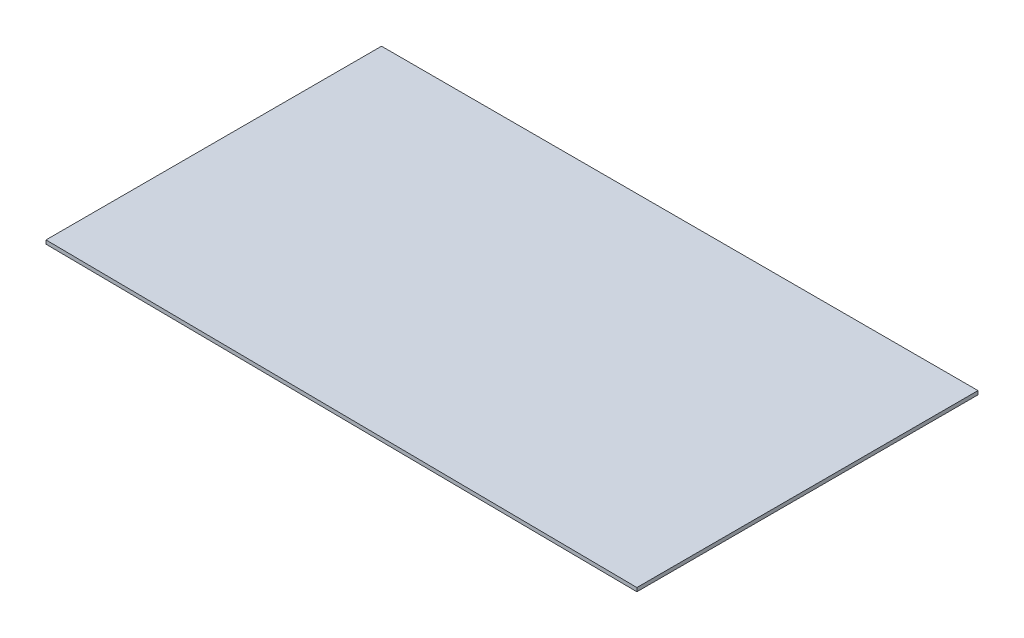
ISO-10303-21;
HEADER;
FILE_DESCRIPTION(('STEP AP214'),'2;1');
FILE_NAME('part.step','',(''),(''),'','','');
FILE_SCHEMA(('AUTOMOTIVE_DESIGN { 1 0 10303 214 1 1 1 1 }'));
ENDSEC;
DATA;
#1=APPLICATION_CONTEXT('core data for automotive mechanical design processes');
#2=APPLICATION_PROTOCOL_DEFINITION('international standard','automotive_design',2000,#1);
#3=PRODUCT_CONTEXT('',#1,'mechanical');
#4=PRODUCT('Part','Part','',(#3));
#5=PRODUCT_RELATED_PRODUCT_CATEGORY('part','',(#4));
#6=PRODUCT_DEFINITION_FORMATION('','',#4);
#7=PRODUCT_DEFINITION_CONTEXT('part definition',#1,'design');
#8=PRODUCT_DEFINITION('design','',#6,#7);
#9=PRODUCT_DEFINITION_SHAPE('','',#8);
#10=(LENGTH_UNIT() NAMED_UNIT(*) SI_UNIT(.MILLI.,.METRE.));
#11=(NAMED_UNIT(*) PLANE_ANGLE_UNIT() SI_UNIT($,.RADIAN.));
#12=(NAMED_UNIT(*) SI_UNIT($,.STERADIAN.) SOLID_ANGLE_UNIT());
#13=UNCERTAINTY_MEASURE_WITH_UNIT(LENGTH_MEASURE(1.E-05),#10,'distance_accuracy_value','');
#14=(GEOMETRIC_REPRESENTATION_CONTEXT(3) GLOBAL_UNCERTAINTY_ASSIGNED_CONTEXT((#13)) GLOBAL_UNIT_ASSIGNED_CONTEXT((#10,
#11,#12)) REPRESENTATION_CONTEXT('',''));
#15=CARTESIAN_POINT('',(0.,0.,0.));
#16=DIRECTION('',(0.,0.,1.));
#17=DIRECTION('',(1.,0.,0.));
#18=AXIS2_PLACEMENT_3D('',#15,#16,#17);
#19=CARTESIAN_POINT('',(0.,0.,0.));
#20=DIRECTION('',(0.,-1.,0.));
#21=DIRECTION('',(0.,0.,-1.));
#22=AXIS2_PLACEMENT_3D('',#19,#20,#21);
#23=PLANE('',#22);
#24=DIRECTION('',(0.,0.,-1.));
#25=VECTOR('',#24,1.);
#26=CARTESIAN_POINT('',(-69.65,0.,37.9795133830879));
#27=LINE('',#26,#25);
#28=CARTESIAN_POINT('',(-69.65,0.,37.9795133830879));
#29=VERTEX_POINT('',#28);
#30=CARTESIAN_POINT('',(-69.65,0.,32.0204866169121));
#31=VERTEX_POINT('',#30);
#32=EDGE_CURVE('E383',#29,#31,#27,.T.);
#33=ORIENTED_EDGE('',*,*,#32,.F.);
#34=CARTESIAN_POINT('',(-70.,0.,35.));
#35=DIRECTION('',(0.,-1.,0.));
#36=DIRECTION('',(0.,0.,-1.));
#37=AXIS2_PLACEMENT_3D('',#34,#35,#36);
#38=CIRCLE('',#37,3.00000000000001);
#39=EDGE_CURVE('E534',#31,#29,#38,.T.);
#40=ORIENTED_EDGE('',*,*,#39,.F.);
#41=EDGE_LOOP('',(#33,#40));
#42=FACE_BOUND('',#41,.T.);
#43=DIRECTION('',(0.,0.,-1.));
#44=VECTOR('',#43,1.);
#45=CARTESIAN_POINT('',(70.35,0.,37.9795133830879));
#46=LINE('',#45,#44);
#47=CARTESIAN_POINT('',(70.35,0.,37.9795133830879));
#48=VERTEX_POINT('',#47);
#49=CARTESIAN_POINT('',(70.35,0.,32.0204866169121));
#50=VERTEX_POINT('',#49);
#51=EDGE_CURVE('E327',#48,#50,#46,.T.);
#52=ORIENTED_EDGE('',*,*,#51,.F.);
#53=CARTESIAN_POINT('',(70.,0.,35.));
#54=DIRECTION('',(0.,-1.,0.));
#55=DIRECTION('',(0.,0.,-1.));
#56=AXIS2_PLACEMENT_3D('',#53,#54,#55);
#57=CIRCLE('',#56,3.00000000000001);
#58=EDGE_CURVE('E70',#50,#48,#57,.T.);
#59=ORIENTED_EDGE('',*,*,#58,.F.);
#60=EDGE_LOOP('',(#52,#59));
#61=FACE_BOUND('',#60,.T.);
#62=DIRECTION('',(0.,0.,-1.));
#63=VECTOR('',#62,1.);
#64=CARTESIAN_POINT('',(70.35,0.,-32.0204866169121));
#65=LINE('',#64,#63);
#66=CARTESIAN_POINT('',(70.35,0.,-32.0204866169121));
#67=VERTEX_POINT('',#66);
#68=CARTESIAN_POINT('',(70.35,0.,-37.9795133830879));
#69=VERTEX_POINT('',#68);
#70=EDGE_CURVE('E262',#67,#69,#65,.T.);
#71=ORIENTED_EDGE('',*,*,#70,.F.);
#72=CARTESIAN_POINT('',(70.,0.,-35.));
#73=DIRECTION('',(0.,-1.,0.));
#74=DIRECTION('',(0.,0.,-1.));
#75=AXIS2_PLACEMENT_3D('',#72,#73,#74);
#76=CIRCLE('',#75,3.00000000000001);
#77=EDGE_CURVE('E646',#69,#67,#76,.T.);
#78=ORIENTED_EDGE('',*,*,#77,.F.);
#79=EDGE_LOOP('',(#71,#78));
#80=FACE_BOUND('',#79,.T.);
#81=DIRECTION('',(0.,0.,-1.));
#82=VECTOR('',#81,1.);
#83=CARTESIAN_POINT('',(-69.65,0.,-32.0204866169121));
#84=LINE('',#83,#82);
#85=CARTESIAN_POINT('',(-69.65,0.,-32.0204866169121));
#86=VERTEX_POINT('',#85);
#87=CARTESIAN_POINT('',(-69.65,0.,-37.9795133830879));
#88=VERTEX_POINT('',#87);
#89=EDGE_CURVE('E605',#86,#88,#84,.T.);
#90=ORIENTED_EDGE('',*,*,#89,.F.);
#91=CARTESIAN_POINT('',(-70.,0.,-35.));
#92=DIRECTION('',(0.,-1.,0.));
#93=DIRECTION('',(0.,0.,-1.));
#94=AXIS2_PLACEMENT_3D('',#91,#92,#93);
#95=CIRCLE('',#94,3.00000000000001);
#96=EDGE_CURVE('E634',#88,#86,#95,.T.);
#97=ORIENTED_EDGE('',*,*,#96,.F.);
#98=EDGE_LOOP('',(#90,#97));
#99=FACE_BOUND('',#98,.T.);
#100=DIRECTION('',(0.,0.,1.));
#101=VECTOR('',#100,1.);
#102=CARTESIAN_POINT('',(-80.,0.,45.));
#103=LINE('',#102,#101);
#104=CARTESIAN_POINT('',(-80.,0.,-45.));
#105=VERTEX_POINT('',#104);
#106=CARTESIAN_POINT('',(-80.,0.,45.));
#107=VERTEX_POINT('',#106);
#108=EDGE_CURVE('E473',#105,#107,#103,.T.);
#109=ORIENTED_EDGE('',*,*,#108,.F.);
#110=DIRECTION('',(-1.,0.,0.));
#111=VECTOR('',#110,1.);
#112=CARTESIAN_POINT('',(-80.,0.,-45.));
#113=LINE('',#112,#111);
#114=CARTESIAN_POINT('',(80.,0.,-45.));
#115=VERTEX_POINT('',#114);
#116=EDGE_CURVE('E482',#115,#105,#113,.T.);
#117=ORIENTED_EDGE('',*,*,#116,.F.);
#118=DIRECTION('',(0.,0.,-1.));
#119=VECTOR('',#118,1.);
#120=CARTESIAN_POINT('',(80.,0.,-45.));
#121=LINE('',#120,#119);
#122=CARTESIAN_POINT('',(80.,0.,46.5056368429094));
#123=VERTEX_POINT('',#122);
#124=EDGE_CURVE('E472',#123,#115,#121,.T.);
#125=ORIENTED_EDGE('',*,*,#124,.F.);
#126=DIRECTION('',(0.999955726723508,0.,0.0094098136464571));
#127=VECTOR('',#126,1.);
#128=CARTESIAN_POINT('',(80.,0.,46.5056368429094));
#129=LINE('',#128,#127);
#130=EDGE_CURVE('E463',#107,#123,#129,.T.);
#131=ORIENTED_EDGE('',*,*,#130,.F.);
#132=EDGE_LOOP('',(#109,#117,#125,#131));
#133=FACE_BOUND('',#132,.T.);
#134=CARTESIAN_POINT('',(69.65,0.,-32.0204866169121));
#135=VERTEX_POINT('',#134);
#136=CARTESIAN_POINT('',(69.65,0.,-37.9795133830879));
#137=VERTEX_POINT('',#136);
#138=EDGE_CURVE('E62',#135,#137,#76,.T.);
#139=ORIENTED_EDGE('',*,*,#138,.F.);
#140=DIRECTION('',(0.,0.,1.));
#141=VECTOR('',#140,1.);
#142=CARTESIAN_POINT('',(69.65,0.,-32.0204866169121));
#143=LINE('',#142,#141);
#144=EDGE_CURVE('E369',#137,#135,#143,.T.);
#145=ORIENTED_EDGE('',*,*,#144,.F.);
#146=EDGE_LOOP('',(#139,#145));
#147=FACE_BOUND('',#146,.T.);
#148=CARTESIAN_POINT('',(-70.35,0.,-32.0204866169121));
#149=VERTEX_POINT('',#148);
#150=CARTESIAN_POINT('',(-70.35,0.,-37.9795133830879));
#151=VERTEX_POINT('',#150);
#152=EDGE_CURVE('E638',#149,#151,#95,.T.);
#153=ORIENTED_EDGE('',*,*,#152,.F.);
#154=DIRECTION('',(0.,0.,1.));
#155=VECTOR('',#154,1.);
#156=CARTESIAN_POINT('',(-70.35,0.,-32.0204866169121));
#157=LINE('',#156,#155);
#158=EDGE_CURVE('E276',#151,#149,#157,.T.);
#159=ORIENTED_EDGE('',*,*,#158,.F.);
#160=EDGE_LOOP('',(#153,#159));
#161=FACE_BOUND('',#160,.T.);
#162=CARTESIAN_POINT('',(-70.35,0.,37.9795133830879));
#163=VERTEX_POINT('',#162);
#164=CARTESIAN_POINT('',(-70.35,0.,32.0204866169121));
#165=VERTEX_POINT('',#164);
#166=EDGE_CURVE('E531',#163,#165,#38,.T.);
#167=ORIENTED_EDGE('',*,*,#166,.F.);
#168=DIRECTION('',(0.,0.,1.));
#169=VECTOR('',#168,1.);
#170=CARTESIAN_POINT('',(-70.35,0.,37.9795133830879));
#171=LINE('',#170,#169);
#172=EDGE_CURVE('E387',#165,#163,#171,.T.);
#173=ORIENTED_EDGE('',*,*,#172,.F.);
#174=EDGE_LOOP('',(#167,#173));
#175=FACE_BOUND('',#174,.T.);
#176=CARTESIAN_POINT('',(69.65,0.,37.9795133830879));
#177=VERTEX_POINT('',#176);
#178=CARTESIAN_POINT('',(69.65,0.,32.0204866169121));
#179=VERTEX_POINT('',#178);
#180=EDGE_CURVE('E252',#177,#179,#57,.T.);
#181=ORIENTED_EDGE('',*,*,#180,.F.);
#182=DIRECTION('',(0.,0.,1.));
#183=VECTOR('',#182,1.);
#184=CARTESIAN_POINT('',(69.65,0.,37.9795133830879));
#185=LINE('',#184,#183);
#186=EDGE_CURVE('E423',#179,#177,#185,.T.);
#187=ORIENTED_EDGE('',*,*,#186,.F.);
#188=EDGE_LOOP('',(#181,#187));
#189=FACE_BOUND('',#188,.T.);
#190=ADVANCED_FACE('F46',(#42,#61,#80,#99,#133,#147,#161,#175,#189),#23,.T.);
#191=CARTESIAN_POINT('',(-80.,1.,45.));
#192=DIRECTION('',(1.,0.,0.));
#193=DIRECTION('',(0.,0.,-1.));
#194=AXIS2_PLACEMENT_3D('',#191,#192,#193);
#195=PLANE('',#194);
#196=ORIENTED_EDGE('',*,*,#108,.T.);
#197=DIRECTION('',(0.,-1.,0.));
#198=VECTOR('',#197,1.);
#199=CARTESIAN_POINT('',(-80.,1.,45.));
#200=LINE('',#199,#198);
#201=CARTESIAN_POINT('',(-80.,1.,45.));
#202=VERTEX_POINT('',#201);
#203=EDGE_CURVE('E12',#202,#107,#200,.T.);
#204=ORIENTED_EDGE('',*,*,#203,.F.);
#205=DIRECTION('',(0.,0.,1.));
#206=VECTOR('',#205,1.);
#207=CARTESIAN_POINT('',(-80.,1.,45.));
#208=LINE('',#207,#206);
#209=CARTESIAN_POINT('',(-80.,1.,-45.));
#210=VERTEX_POINT('',#209);
#211=EDGE_CURVE('E486',#210,#202,#208,.T.);
#212=ORIENTED_EDGE('',*,*,#211,.F.);
#213=DIRECTION('',(0.,-1.,0.));
#214=VECTOR('',#213,1.);
#215=CARTESIAN_POINT('',(-80.,1.,-45.));
#216=LINE('',#215,#214);
#217=EDGE_CURVE('E490',#210,#105,#216,.T.);
#218=ORIENTED_EDGE('',*,*,#217,.T.);
#219=EDGE_LOOP('',(#196,#204,#212,#218));
#220=FACE_BOUND('',#219,.T.);
#221=ADVANCED_FACE('F48',(#220),#195,.F.);
#222=CARTESIAN_POINT('',(80.,1.,46.5056368429094));
#223=DIRECTION('',(0.0094098136464571,0.,-0.999955726723508));
#224=DIRECTION('',(-0.999955726723508,0.,-0.0094098136464571));
#225=AXIS2_PLACEMENT_3D('',#222,#223,#224);
#226=PLANE('',#225);
#227=ORIENTED_EDGE('',*,*,#130,.T.);
#228=DIRECTION('',(0.,-1.,0.));
#229=VECTOR('',#228,1.);
#230=CARTESIAN_POINT('',(80.,1.,46.5056368429094));
#231=LINE('',#230,#229);
#232=CARTESIAN_POINT('',(80.,1.,46.5056368429094));
#233=VERTEX_POINT('',#232);
#234=EDGE_CURVE('E55',#233,#123,#231,.T.);
#235=ORIENTED_EDGE('',*,*,#234,.F.);
#236=DIRECTION('',(0.999955726723508,0.,0.0094098136464571));
#237=VECTOR('',#236,1.);
#238=CARTESIAN_POINT('',(80.,1.,46.5056368429094));
#239=LINE('',#238,#237);
#240=EDGE_CURVE('E503',#202,#233,#239,.T.);
#241=ORIENTED_EDGE('',*,*,#240,.F.);
#242=ORIENTED_EDGE('',*,*,#203,.T.);
#243=EDGE_LOOP('',(#227,#235,#241,#242));
#244=FACE_BOUND('',#243,.T.);
#245=ADVANCED_FACE('F454',(#244),#226,.F.);
#246=CARTESIAN_POINT('',(80.,1.,-45.));
#247=DIRECTION('',(-1.,0.,0.));
#248=DIRECTION('',(0.,0.,1.));
#249=AXIS2_PLACEMENT_3D('',#246,#247,#248);
#250=PLANE('',#249);
#251=ORIENTED_EDGE('',*,*,#124,.T.);
#252=DIRECTION('',(0.,-1.,0.));
#253=VECTOR('',#252,1.);
#254=CARTESIAN_POINT('',(80.,1.,-45.));
#255=LINE('',#254,#253);
#256=CARTESIAN_POINT('',(80.,1.,-45.));
#257=VERTEX_POINT('',#256);
#258=EDGE_CURVE('E479',#257,#115,#255,.T.);
#259=ORIENTED_EDGE('',*,*,#258,.F.);
#260=DIRECTION('',(0.,0.,-1.));
#261=VECTOR('',#260,1.);
#262=CARTESIAN_POINT('',(80.,1.,-45.));
#263=LINE('',#262,#261);
#264=EDGE_CURVE('E477',#233,#257,#263,.T.);
#265=ORIENTED_EDGE('',*,*,#264,.F.);
#266=ORIENTED_EDGE('',*,*,#234,.T.);
#267=EDGE_LOOP('',(#251,#259,#265,#266));
#268=FACE_BOUND('',#267,.T.);
#269=ADVANCED_FACE('F451',(#268),#250,.F.);
#270=CARTESIAN_POINT('',(-80.,1.,-45.));
#271=DIRECTION('',(0.,0.,1.));
#272=DIRECTION('',(1.,0.,0.));
#273=AXIS2_PLACEMENT_3D('',#270,#271,#272);
#274=PLANE('',#273);
#275=ORIENTED_EDGE('',*,*,#116,.T.);
#276=ORIENTED_EDGE('',*,*,#217,.F.);
#277=DIRECTION('',(-1.,0.,0.));
#278=VECTOR('',#277,1.);
#279=CARTESIAN_POINT('',(-80.,1.,-45.));
#280=LINE('',#279,#278);
#281=EDGE_CURVE('E494',#257,#210,#280,.T.);
#282=ORIENTED_EDGE('',*,*,#281,.F.);
#283=ORIENTED_EDGE('',*,*,#258,.T.);
#284=EDGE_LOOP('',(#275,#276,#282,#283));
#285=FACE_BOUND('',#284,.T.);
#286=ADVANCED_FACE('F444',(#285),#274,.F.);
#287=CARTESIAN_POINT('',(0.,1.,0.));
#288=DIRECTION('',(0.,-1.,0.));
#289=DIRECTION('',(0.,0.,-1.));
#290=AXIS2_PLACEMENT_3D('',#287,#288,#289);
#291=PLANE('',#290);
#292=ORIENTED_EDGE('',*,*,#211,.T.);
#293=ORIENTED_EDGE('',*,*,#240,.T.);
#294=ORIENTED_EDGE('',*,*,#264,.T.);
#295=ORIENTED_EDGE('',*,*,#281,.T.);
#296=EDGE_LOOP('',(#292,#293,#294,#295));
#297=FACE_BOUND('',#296,.T.);
#298=ADVANCED_FACE('F439',(#297),#291,.F.);
#299=CARTESIAN_POINT('',(-70.35,-2.7,35.));
#300=DIRECTION('',(0.,-1.,0.));
#301=DIRECTION('',(-1.,0.,0.));
#302=AXIS2_PLACEMENT_3D('',#299,#300,#301);
#303=ELLIPSE('',#302,3.,2.97951338308793);
#304=DIRECTION('',(0.,1.,0.));
#305=VECTOR('',#304,1.);
#306=SURFACE_OF_LINEAR_EXTRUSION('',#303,#305);
#307=DIRECTION('',(0.,1.,0.));
#308=VECTOR('',#307,1.);
#309=CARTESIAN_POINT('',(-70.35,-2.7,37.9795133830879));
#310=LINE('',#309,#308);
#311=CARTESIAN_POINT('',(-70.35,-2.7,37.9795133830879));
#312=VERTEX_POINT('',#311);
#313=CARTESIAN_POINT('',(-70.35,-2.,37.9795133830879));
#314=VERTEX_POINT('',#313);
#315=EDGE_CURVE('E510',#312,#314,#310,.T.);
#316=ORIENTED_EDGE('',*,*,#315,.T.);
#317=CARTESIAN_POINT('',(-70.35,-2.,35.));
#318=DIRECTION('',(0.,-1.,0.));
#319=DIRECTION('',(-1.,0.,0.));
#320=AXIS2_PLACEMENT_3D('',#317,#318,#319);
#321=ELLIPSE('',#320,3.,2.97951338308793);
#322=CARTESIAN_POINT('',(-70.35,-2.,32.0204866169121));
#323=VERTEX_POINT('',#322);
#324=EDGE_CURVE('E241',#314,#323,#321,.T.);
#325=ORIENTED_EDGE('',*,*,#324,.T.);
#326=DIRECTION('',(0.,1.,0.));
#327=VECTOR('',#326,1.);
#328=CARTESIAN_POINT('',(-70.35,-2.7,32.0204866169121));
#329=LINE('',#328,#327);
#330=CARTESIAN_POINT('',(-70.35,-2.7,32.0204866169121));
#331=VERTEX_POINT('',#330);
#332=EDGE_CURVE('E507',#331,#323,#329,.T.);
#333=ORIENTED_EDGE('',*,*,#332,.F.);
#334=EDGE_CURVE('E426',#312,#331,#303,.T.);
#335=ORIENTED_EDGE('',*,*,#334,.F.);
#336=EDGE_LOOP('',(#316,#325,#333,#335));
#337=FACE_BOUND('',#336,.T.);
#338=ADVANCED_FACE('F434',(#337),#306,.F.);
#339=CARTESIAN_POINT('',(-70.35,-2.7,37.9795133830879));
#340=DIRECTION('',(-1.,0.,0.));
#341=DIRECTION('',(0.,0.,1.));
#342=AXIS2_PLACEMENT_3D('',#339,#340,#341);
#343=PLANE('',#342);
#344=ORIENTED_EDGE('',*,*,#172,.T.);
#345=DIRECTION('',(0.,1.,0.));
#346=VECTOR('',#345,1.);
#347=CARTESIAN_POINT('',(-70.35,-2.,37.9795133830879));
#348=LINE('',#347,#346);
#349=EDGE_CURVE('E526',#163,#314,#348,.F.);
#350=ORIENTED_EDGE('',*,*,#349,.T.);
#351=ORIENTED_EDGE('',*,*,#315,.F.);
#352=DIRECTION('',(0.,0.,1.));
#353=VECTOR('',#352,1.);
#354=CARTESIAN_POINT('',(-70.35,-2.7,37.9795133830879));
#355=LINE('',#354,#353);
#356=EDGE_CURVE('E431',#331,#312,#355,.T.);
#357=ORIENTED_EDGE('',*,*,#356,.F.);
#358=ORIENTED_EDGE('',*,*,#332,.T.);
#359=DIRECTION('',(0.,1.,0.));
#360=VECTOR('',#359,1.);
#361=CARTESIAN_POINT('',(-70.35,-2.,32.0204866169121));
#362=LINE('',#361,#360);
#363=EDGE_CURVE('E527',#323,#165,#362,.T.);
#364=ORIENTED_EDGE('',*,*,#363,.T.);
#365=EDGE_LOOP('',(#344,#350,#351,#357,#358,#364));
#366=FACE_BOUND('',#365,.T.);
#367=ADVANCED_FACE('F438',(#366),#343,.F.);
#368=CARTESIAN_POINT('',(-70.35,-2.7,35.));
#369=DIRECTION('',(0.,-1.,0.));
#370=DIRECTION('',(0.,0.,-1.));
#371=AXIS2_PLACEMENT_3D('',#368,#369,#370);
#372=PLANE('',#371);
#373=ORIENTED_EDGE('',*,*,#334,.T.);
#374=ORIENTED_EDGE('',*,*,#356,.T.);
#375=EDGE_LOOP('',(#373,#374));
#376=FACE_BOUND('',#375,.T.);
#377=ADVANCED_FACE('F292',(#376),#372,.T.);
#378=CARTESIAN_POINT('',(70.35,-2.7,-35.));
#379=DIRECTION('',(0.,-1.,0.));
#380=DIRECTION('',(1.,0.,0.));
#381=AXIS2_PLACEMENT_3D('',#378,#379,#380);
#382=ELLIPSE('',#381,3.,2.97951338308793);
#383=DIRECTION('',(0.,1.,0.));
#384=VECTOR('',#383,1.);
#385=SURFACE_OF_LINEAR_EXTRUSION('',#382,#384);
#386=DIRECTION('',(0.,1.,0.));
#387=VECTOR('',#386,1.);
#388=CARTESIAN_POINT('',(70.35,-2.7,-37.9795133830879));
#389=LINE('',#388,#387);
#390=CARTESIAN_POINT('',(70.35,-2.7,-37.9795133830879));
#391=VERTEX_POINT('',#390);
#392=CARTESIAN_POINT('',(70.35,-2.,-37.9795133830879));
#393=VERTEX_POINT('',#392);
#394=EDGE_CURVE('E259',#391,#393,#389,.T.);
#395=ORIENTED_EDGE('',*,*,#394,.T.);
#396=CARTESIAN_POINT('',(70.35,-2.,-35.));
#397=DIRECTION('',(0.,-1.,0.));
#398=DIRECTION('',(1.,0.,0.));
#399=AXIS2_PLACEMENT_3D('',#396,#397,#398);
#400=ELLIPSE('',#399,3.,2.97951338308793);
#401=CARTESIAN_POINT('',(70.35,-2.,-32.0204866169121));
#402=VERTEX_POINT('',#401);
#403=EDGE_CURVE('E232',#393,#402,#400,.T.);
#404=ORIENTED_EDGE('',*,*,#403,.T.);
#405=DIRECTION('',(0.,1.,0.));
#406=VECTOR('',#405,1.);
#407=CARTESIAN_POINT('',(70.35,-2.7,-32.0204866169121));
#408=LINE('',#407,#406);
#409=CARTESIAN_POINT('',(70.35,-2.7,-32.0204866169121));
#410=VERTEX_POINT('',#409);
#411=EDGE_CURVE('E271',#410,#402,#408,.T.);
#412=ORIENTED_EDGE('',*,*,#411,.F.);
#413=EDGE_CURVE('E268',#391,#410,#382,.T.);
#414=ORIENTED_EDGE('',*,*,#413,.F.);
#415=EDGE_LOOP('',(#395,#404,#412,#414));
#416=FACE_BOUND('',#415,.T.);
#417=ADVANCED_FACE('F266',(#416),#385,.F.);
#418=CARTESIAN_POINT('',(70.35,-2.7,-32.0204866169121));
#419=DIRECTION('',(1.,0.,0.));
#420=DIRECTION('',(0.,0.,-1.));
#421=AXIS2_PLACEMENT_3D('',#418,#419,#420);
#422=PLANE('',#421);
#423=ORIENTED_EDGE('',*,*,#70,.T.);
#424=DIRECTION('',(0.,1.,0.));
#425=VECTOR('',#424,1.);
#426=CARTESIAN_POINT('',(70.35,-2.,-37.9795133830879));
#427=LINE('',#426,#425);
#428=EDGE_CURVE('E247',#69,#393,#427,.F.);
#429=ORIENTED_EDGE('',*,*,#428,.T.);
#430=ORIENTED_EDGE('',*,*,#394,.F.);
#431=DIRECTION('',(0.,0.,-1.));
#432=VECTOR('',#431,1.);
#433=CARTESIAN_POINT('',(70.35,-2.7,-32.0204866169121));
#434=LINE('',#433,#432);
#435=EDGE_CURVE('E270',#410,#391,#434,.T.);
#436=ORIENTED_EDGE('',*,*,#435,.F.);
#437=ORIENTED_EDGE('',*,*,#411,.T.);
#438=DIRECTION('',(0.,1.,0.));
#439=VECTOR('',#438,1.);
#440=CARTESIAN_POINT('',(70.35,-2.,-32.0204866169121));
#441=LINE('',#440,#439);
#442=EDGE_CURVE('E250',#402,#67,#441,.T.);
#443=ORIENTED_EDGE('',*,*,#442,.T.);
#444=EDGE_LOOP('',(#423,#429,#430,#436,#437,#443));
#445=FACE_BOUND('',#444,.T.);
#446=ADVANCED_FACE('F258',(#445),#422,.F.);
#447=CARTESIAN_POINT('',(70.35,-2.7,-35.));
#448=DIRECTION('',(0.,1.,0.));
#449=DIRECTION('',(0.,0.,1.));
#450=AXIS2_PLACEMENT_3D('',#447,#448,#449);
#451=PLANE('',#450);
#452=ORIENTED_EDGE('',*,*,#413,.T.);
#453=ORIENTED_EDGE('',*,*,#435,.T.);
#454=EDGE_LOOP('',(#452,#453));
#455=FACE_BOUND('',#454,.T.);
#456=ADVANCED_FACE('F297',(#455),#451,.F.);
#457=CARTESIAN_POINT('',(-70.35,-2.7,-35.));
#458=DIRECTION('',(0.,-1.,0.));
#459=DIRECTION('',(-1.,0.,0.));
#460=AXIS2_PLACEMENT_3D('',#457,#458,#459);
#461=ELLIPSE('',#460,3.,2.97951338308793);
#462=DIRECTION('',(0.,1.,0.));
#463=VECTOR('',#462,1.);
#464=SURFACE_OF_LINEAR_EXTRUSION('',#461,#463);
#465=DIRECTION('',(0.,1.,0.));
#466=VECTOR('',#465,1.);
#467=CARTESIAN_POINT('',(-70.35,-2.7,-32.0204866169121));
#468=LINE('',#467,#466);
#469=CARTESIAN_POINT('',(-70.35,-2.7,-32.0204866169121));
#470=VERTEX_POINT('',#469);
#471=CARTESIAN_POINT('',(-70.35,-2.,-32.0204866169121));
#472=VERTEX_POINT('',#471);
#473=EDGE_CURVE('E1037',#470,#472,#468,.T.);
#474=ORIENTED_EDGE('',*,*,#473,.T.);
#475=CARTESIAN_POINT('',(-70.35,-2.,-35.));
#476=DIRECTION('',(0.,-1.,0.));
#477=DIRECTION('',(-1.,0.,0.));
#478=AXIS2_PLACEMENT_3D('',#475,#476,#477);
#479=ELLIPSE('',#478,3.,2.97951338308793);
#480=CARTESIAN_POINT('',(-70.35,-2.,-37.9795133830879));
#481=VERTEX_POINT('',#480);
#482=EDGE_CURVE('E242',#472,#481,#479,.T.);
#483=ORIENTED_EDGE('',*,*,#482,.T.);
#484=DIRECTION('',(0.,1.,0.));
#485=VECTOR('',#484,1.);
#486=CARTESIAN_POINT('',(-70.35,-2.7,-37.9795133830879));
#487=LINE('',#486,#485);
#488=CARTESIAN_POINT('',(-70.35,-2.7,-37.9795133830879));
#489=VERTEX_POINT('',#488);
#490=EDGE_CURVE('E286',#489,#481,#487,.T.);
#491=ORIENTED_EDGE('',*,*,#490,.F.);
#492=EDGE_CURVE('E308',#470,#489,#461,.T.);
#493=ORIENTED_EDGE('',*,*,#492,.F.);
#494=EDGE_LOOP('',(#474,#483,#491,#493));
#495=FACE_BOUND('',#494,.T.);
#496=ADVANCED_FACE('F300',(#495),#464,.F.);
#497=CARTESIAN_POINT('',(-70.35,-2.7,-32.0204866169121));
#498=DIRECTION('',(-1.,0.,0.));
#499=DIRECTION('',(0.,0.,1.));
#500=AXIS2_PLACEMENT_3D('',#497,#498,#499);
#501=PLANE('',#500);
#502=ORIENTED_EDGE('',*,*,#158,.T.);
#503=DIRECTION('',(0.,1.,0.));
#504=VECTOR('',#503,1.);
#505=CARTESIAN_POINT('',(-70.35,-2.,-32.0204866169121));
#506=LINE('',#505,#504);
#507=EDGE_CURVE('E590',#149,#472,#506,.F.);
#508=ORIENTED_EDGE('',*,*,#507,.T.);
#509=ORIENTED_EDGE('',*,*,#473,.F.);
#510=DIRECTION('',(0.,0.,1.));
#511=VECTOR('',#510,1.);
#512=CARTESIAN_POINT('',(-70.35,-2.7,-32.0204866169121));
#513=LINE('',#512,#511);
#514=EDGE_CURVE('E314',#489,#470,#513,.T.);
#515=ORIENTED_EDGE('',*,*,#514,.F.);
#516=ORIENTED_EDGE('',*,*,#490,.T.);
#517=DIRECTION('',(0.,1.,0.));
#518=VECTOR('',#517,1.);
#519=CARTESIAN_POINT('',(-70.35,-2.,-37.9795133830879));
#520=LINE('',#519,#518);
#521=EDGE_CURVE('E586',#481,#151,#520,.T.);
#522=ORIENTED_EDGE('',*,*,#521,.T.);
#523=EDGE_LOOP('',(#502,#508,#509,#515,#516,#522));
#524=FACE_BOUND('',#523,.T.);
#525=ADVANCED_FACE('F305',(#524),#501,.F.);
#526=CARTESIAN_POINT('',(-70.35,-2.7,-35.));
#527=DIRECTION('',(0.,-1.,0.));
#528=DIRECTION('',(0.,0.,-1.));
#529=AXIS2_PLACEMENT_3D('',#526,#527,#528);
#530=PLANE('',#529);
#531=ORIENTED_EDGE('',*,*,#492,.T.);
#532=ORIENTED_EDGE('',*,*,#514,.T.);
#533=EDGE_LOOP('',(#531,#532));
#534=FACE_BOUND('',#533,.T.);
#535=ADVANCED_FACE('F348',(#534),#530,.T.);
#536=CARTESIAN_POINT('',(-69.65,-2.7,-35.));
#537=DIRECTION('',(0.,-1.,0.));
#538=DIRECTION('',(1.,0.,0.));
#539=AXIS2_PLACEMENT_3D('',#536,#537,#538);
#540=ELLIPSE('',#539,3.,2.97951338308793);
#541=DIRECTION('',(0.,1.,0.));
#542=VECTOR('',#541,1.);
#543=SURFACE_OF_LINEAR_EXTRUSION('',#540,#542);
#544=DIRECTION('',(0.,1.,0.));
#545=VECTOR('',#544,1.);
#546=CARTESIAN_POINT('',(-69.65,-2.7,-37.9795133830879));
#547=LINE('',#546,#545);
#548=CARTESIAN_POINT('',(-69.65,-2.7,-37.9795133830879));
#549=VERTEX_POINT('',#548);
#550=CARTESIAN_POINT('',(-69.65,-2.,-37.9795133830879));
#551=VERTEX_POINT('',#550);
#552=EDGE_CURVE('E600',#549,#551,#547,.T.);
#553=ORIENTED_EDGE('',*,*,#552,.T.);
#554=CARTESIAN_POINT('',(-69.65,-2.,-35.));
#555=DIRECTION('',(0.,-1.,0.));
#556=DIRECTION('',(1.,0.,0.));
#557=AXIS2_PLACEMENT_3D('',#554,#555,#556);
#558=ELLIPSE('',#557,3.,2.97951338308793);
#559=CARTESIAN_POINT('',(-69.65,-2.,-32.0204866169121));
#560=VERTEX_POINT('',#559);
#561=EDGE_CURVE('E564',#551,#560,#558,.T.);
#562=ORIENTED_EDGE('',*,*,#561,.T.);
#563=DIRECTION('',(0.,1.,0.));
#564=VECTOR('',#563,1.);
#565=CARTESIAN_POINT('',(-69.65,-2.7,-32.0204866169121));
#566=LINE('',#565,#564);
#567=CARTESIAN_POINT('',(-69.65,-2.7,-32.0204866169121));
#568=VERTEX_POINT('',#567);
#569=EDGE_CURVE('E595',#568,#560,#566,.T.);
#570=ORIENTED_EDGE('',*,*,#569,.F.);
#571=EDGE_CURVE('E609',#549,#568,#540,.T.);
#572=ORIENTED_EDGE('',*,*,#571,.F.);
#573=EDGE_LOOP('',(#553,#562,#570,#572));
#574=FACE_BOUND('',#573,.T.);
#575=ADVANCED_FACE('F615',(#574),#543,.F.);
#576=CARTESIAN_POINT('',(-69.65,-2.7,-32.0204866169121));
#577=DIRECTION('',(1.,0.,0.));
#578=DIRECTION('',(0.,0.,-1.));
#579=AXIS2_PLACEMENT_3D('',#576,#577,#578);
#580=PLANE('',#579);
#581=ORIENTED_EDGE('',*,*,#89,.T.);
#582=EDGE_CURVE('E599',#551,#88,#547,.T.);
#583=ORIENTED_EDGE('',*,*,#582,.F.);
#584=ORIENTED_EDGE('',*,*,#552,.F.);
#585=DIRECTION('',(0.,0.,-1.));
#586=VECTOR('',#585,1.);
#587=CARTESIAN_POINT('',(-69.65,-2.7,-32.0204866169121));
#588=LINE('',#587,#586);
#589=EDGE_CURVE('E604',#568,#549,#588,.T.);
#590=ORIENTED_EDGE('',*,*,#589,.F.);
#591=ORIENTED_EDGE('',*,*,#569,.T.);
#592=EDGE_CURVE('E594',#560,#86,#566,.T.);
#593=ORIENTED_EDGE('',*,*,#592,.T.);
#594=EDGE_LOOP('',(#581,#583,#584,#590,#591,#593));
#595=FACE_BOUND('',#594,.T.);
#596=ADVANCED_FACE('F618',(#595),#580,.F.);
#597=CARTESIAN_POINT('',(-69.65,-2.7,-35.));
#598=DIRECTION('',(0.,1.,0.));
#599=DIRECTION('',(0.,0.,1.));
#600=AXIS2_PLACEMENT_3D('',#597,#598,#599);
#601=PLANE('',#600);
#602=ORIENTED_EDGE('',*,*,#571,.T.);
#603=ORIENTED_EDGE('',*,*,#589,.T.);
#604=EDGE_LOOP('',(#602,#603));
#605=FACE_BOUND('',#604,.T.);
#606=ADVANCED_FACE('F293',(#605),#601,.F.);
#607=CARTESIAN_POINT('',(-69.65,-2.7,35.));
#608=DIRECTION('',(0.,-1.,0.));
#609=DIRECTION('',(1.,0.,0.));
#610=AXIS2_PLACEMENT_3D('',#607,#608,#609);
#611=ELLIPSE('',#610,3.,2.97951338308793);
#612=DIRECTION('',(0.,1.,0.));
#613=VECTOR('',#612,1.);
#614=SURFACE_OF_LINEAR_EXTRUSION('',#611,#613);
#615=DIRECTION('',(0.,1.,0.));
#616=VECTOR('',#615,1.);
#617=CARTESIAN_POINT('',(-69.65,-2.7,32.0204866169121));
#618=LINE('',#617,#616);
#619=CARTESIAN_POINT('',(-69.65,-2.7,32.0204866169121));
#620=VERTEX_POINT('',#619);
#621=CARTESIAN_POINT('',(-69.65,-2.,32.0204866169121));
#622=VERTEX_POINT('',#621);
#623=EDGE_CURVE('E378',#620,#622,#618,.T.);
#624=ORIENTED_EDGE('',*,*,#623,.T.);
#625=CARTESIAN_POINT('',(-69.65,-2.,35.));
#626=DIRECTION('',(0.,-1.,0.));
#627=DIRECTION('',(1.,0.,0.));
#628=AXIS2_PLACEMENT_3D('',#625,#626,#627);
#629=ELLIPSE('',#628,3.,2.97951338308793);
#630=CARTESIAN_POINT('',(-69.65,-2.,37.9795133830879));
#631=VERTEX_POINT('',#630);
#632=EDGE_CURVE('E560',#622,#631,#629,.T.);
#633=ORIENTED_EDGE('',*,*,#632,.T.);
#634=DIRECTION('',(0.,1.,0.));
#635=VECTOR('',#634,1.);
#636=CARTESIAN_POINT('',(-69.65,-2.7,37.9795133830879));
#637=LINE('',#636,#635);
#638=CARTESIAN_POINT('',(-69.65,-2.7,37.9795133830879));
#639=VERTEX_POINT('',#638);
#640=EDGE_CURVE('E372',#639,#631,#637,.T.);
#641=ORIENTED_EDGE('',*,*,#640,.F.);
#642=EDGE_CURVE('E388',#620,#639,#611,.T.);
#643=ORIENTED_EDGE('',*,*,#642,.F.);
#644=EDGE_LOOP('',(#624,#633,#641,#643));
#645=FACE_BOUND('',#644,.T.);
#646=ADVANCED_FACE('F397',(#645),#614,.F.);
#647=CARTESIAN_POINT('',(-69.65,-2.7,37.9795133830879));
#648=DIRECTION('',(1.,0.,0.));
#649=DIRECTION('',(0.,0.,-1.));
#650=AXIS2_PLACEMENT_3D('',#647,#648,#649);
#651=PLANE('',#650);
#652=ORIENTED_EDGE('',*,*,#32,.T.);
#653=EDGE_CURVE('E376',#622,#31,#618,.T.);
#654=ORIENTED_EDGE('',*,*,#653,.F.);
#655=ORIENTED_EDGE('',*,*,#623,.F.);
#656=DIRECTION('',(0.,0.,-1.));
#657=VECTOR('',#656,1.);
#658=CARTESIAN_POINT('',(-69.65,-2.7,37.9795133830879));
#659=LINE('',#658,#657);
#660=EDGE_CURVE('E382',#639,#620,#659,.T.);
#661=ORIENTED_EDGE('',*,*,#660,.F.);
#662=ORIENTED_EDGE('',*,*,#640,.T.);
#663=EDGE_CURVE('E377',#631,#29,#637,.T.);
#664=ORIENTED_EDGE('',*,*,#663,.T.);
#665=EDGE_LOOP('',(#652,#654,#655,#661,#662,#664));
#666=FACE_BOUND('',#665,.T.);
#667=ADVANCED_FACE('F400',(#666),#651,.F.);
#668=CARTESIAN_POINT('',(-69.65,-2.7,35.));
#669=DIRECTION('',(0.,1.,0.));
#670=DIRECTION('',(0.,0.,1.));
#671=AXIS2_PLACEMENT_3D('',#668,#669,#670);
#672=PLANE('',#671);
#673=ORIENTED_EDGE('',*,*,#642,.T.);
#674=ORIENTED_EDGE('',*,*,#660,.T.);
#675=EDGE_LOOP('',(#673,#674));
#676=FACE_BOUND('',#675,.T.);
#677=ADVANCED_FACE('F405',(#676),#672,.F.);
#678=CARTESIAN_POINT('',(69.65,-2.7,35.));
#679=DIRECTION('',(0.,-1.,0.));
#680=DIRECTION('',(-1.,0.,0.));
#681=AXIS2_PLACEMENT_3D('',#678,#679,#680);
#682=ELLIPSE('',#681,3.,2.97951338308793);
#683=DIRECTION('',(0.,1.,0.));
#684=VECTOR('',#683,1.);
#685=SURFACE_OF_LINEAR_EXTRUSION('',#682,#684);
#686=DIRECTION('',(0.,1.,0.));
#687=VECTOR('',#686,1.);
#688=CARTESIAN_POINT('',(69.65,-2.7,37.9795133830879));
#689=LINE('',#688,#687);
#690=CARTESIAN_POINT('',(69.65,-2.7,37.9795133830879));
#691=VERTEX_POINT('',#690);
#692=CARTESIAN_POINT('',(69.65,-2.,37.9795133830879));
#693=VERTEX_POINT('',#692);
#694=EDGE_CURVE('E664',#691,#693,#689,.T.);
#695=ORIENTED_EDGE('',*,*,#694,.T.);
#696=CARTESIAN_POINT('',(69.65,-2.,35.));
#697=DIRECTION('',(0.,-1.,0.));
#698=DIRECTION('',(-1.,0.,0.));
#699=AXIS2_PLACEMENT_3D('',#696,#697,#698);
#700=ELLIPSE('',#699,3.,2.97951338308793);
#701=CARTESIAN_POINT('',(69.65,-2.,32.0204866169121));
#702=VERTEX_POINT('',#701);
#703=EDGE_CURVE('E556',#693,#702,#700,.T.);
#704=ORIENTED_EDGE('',*,*,#703,.T.);
#705=DIRECTION('',(0.,1.,0.));
#706=VECTOR('',#705,1.);
#707=CARTESIAN_POINT('',(69.65,-2.7,32.0204866169121));
#708=LINE('',#707,#706);
#709=CARTESIAN_POINT('',(69.65,-2.7,32.0204866169121));
#710=VERTEX_POINT('',#709);
#711=EDGE_CURVE('E331',#710,#702,#708,.T.);
#712=ORIENTED_EDGE('',*,*,#711,.F.);
#713=EDGE_CURVE('E417',#691,#710,#682,.T.);
#714=ORIENTED_EDGE('',*,*,#713,.F.);
#715=EDGE_LOOP('',(#695,#704,#712,#714));
#716=FACE_BOUND('',#715,.T.);
#717=ADVANCED_FACE('F409',(#716),#685,.F.);
#718=CARTESIAN_POINT('',(69.65,-2.7,37.9795133830879));
#719=DIRECTION('',(-1.,0.,0.));
#720=DIRECTION('',(0.,0.,1.));
#721=AXIS2_PLACEMENT_3D('',#718,#719,#720);
#722=PLANE('',#721);
#723=ORIENTED_EDGE('',*,*,#186,.T.);
#724=DIRECTION('',(0.,1.,0.));
#725=VECTOR('',#724,1.);
#726=CARTESIAN_POINT('',(69.65,-2.,37.9795133830879));
#727=LINE('',#726,#725);
#728=EDGE_CURVE('E578',#177,#693,#727,.F.);
#729=ORIENTED_EDGE('',*,*,#728,.T.);
#730=ORIENTED_EDGE('',*,*,#694,.F.);
#731=DIRECTION('',(0.,0.,1.));
#732=VECTOR('',#731,1.);
#733=CARTESIAN_POINT('',(69.65,-2.7,37.9795133830879));
#734=LINE('',#733,#732);
#735=EDGE_CURVE('E424',#710,#691,#734,.T.);
#736=ORIENTED_EDGE('',*,*,#735,.F.);
#737=ORIENTED_EDGE('',*,*,#711,.T.);
#738=DIRECTION('',(0.,1.,0.));
#739=VECTOR('',#738,1.);
#740=CARTESIAN_POINT('',(69.65,-2.,32.0204866169121));
#741=LINE('',#740,#739);
#742=EDGE_CURVE('E574',#702,#179,#741,.T.);
#743=ORIENTED_EDGE('',*,*,#742,.T.);
#744=EDGE_LOOP('',(#723,#729,#730,#736,#737,#743));
#745=FACE_BOUND('',#744,.T.);
#746=ADVANCED_FACE('F414',(#745),#722,.F.);
#747=CARTESIAN_POINT('',(69.65,-2.7,35.));
#748=DIRECTION('',(0.,-1.,0.));
#749=DIRECTION('',(0.,0.,-1.));
#750=AXIS2_PLACEMENT_3D('',#747,#748,#749);
#751=PLANE('',#750);
#752=ORIENTED_EDGE('',*,*,#713,.T.);
#753=ORIENTED_EDGE('',*,*,#735,.T.);
#754=EDGE_LOOP('',(#752,#753));
#755=FACE_BOUND('',#754,.T.);
#756=ADVANCED_FACE('F346',(#755),#751,.T.);
#757=CARTESIAN_POINT('',(70.35,-2.7,35.));
#758=DIRECTION('',(0.,-1.,0.));
#759=DIRECTION('',(1.,0.,0.));
#760=AXIS2_PLACEMENT_3D('',#757,#758,#759);
#761=ELLIPSE('',#760,3.,2.97951338308793);
#762=DIRECTION('',(0.,1.,0.));
#763=VECTOR('',#762,1.);
#764=SURFACE_OF_LINEAR_EXTRUSION('',#761,#763);
#765=DIRECTION('',(0.,1.,0.));
#766=VECTOR('',#765,1.);
#767=CARTESIAN_POINT('',(70.35,-2.7,32.0204866169121));
#768=LINE('',#767,#766);
#769=CARTESIAN_POINT('',(70.35,-2.7,32.0204866169121));
#770=VERTEX_POINT('',#769);
#771=CARTESIAN_POINT('',(70.35,-2.,32.0204866169121));
#772=VERTEX_POINT('',#771);
#773=EDGE_CURVE('E322',#770,#772,#768,.T.);
#774=ORIENTED_EDGE('',*,*,#773,.T.);
#775=CARTESIAN_POINT('',(70.35,-2.,35.));
#776=DIRECTION('',(0.,-1.,0.));
#777=DIRECTION('',(1.,0.,0.));
#778=AXIS2_PLACEMENT_3D('',#775,#776,#777);
#779=ELLIPSE('',#778,3.,2.97951338308793);
#780=CARTESIAN_POINT('',(70.35,-2.,37.9795133830879));
#781=VERTEX_POINT('',#780);
#782=EDGE_CURVE('E552',#772,#781,#779,.T.);
#783=ORIENTED_EDGE('',*,*,#782,.T.);
#784=DIRECTION('',(0.,1.,0.));
#785=VECTOR('',#784,1.);
#786=CARTESIAN_POINT('',(70.35,-2.7,37.9795133830879));
#787=LINE('',#786,#785);
#788=CARTESIAN_POINT('',(70.35,-2.7,37.9795133830879));
#789=VERTEX_POINT('',#788);
#790=EDGE_CURVE('E316',#789,#781,#787,.T.);
#791=ORIENTED_EDGE('',*,*,#790,.F.);
#792=EDGE_CURVE('E332',#770,#789,#761,.T.);
#793=ORIENTED_EDGE('',*,*,#792,.F.);
#794=EDGE_LOOP('',(#774,#783,#791,#793));
#795=FACE_BOUND('',#794,.T.);
#796=ADVANCED_FACE('F342',(#795),#764,.F.);
#797=CARTESIAN_POINT('',(70.35,-2.7,37.9795133830879));
#798=DIRECTION('',(1.,0.,0.));
#799=DIRECTION('',(0.,0.,-1.));
#800=AXIS2_PLACEMENT_3D('',#797,#798,#799);
#801=PLANE('',#800);
#802=ORIENTED_EDGE('',*,*,#51,.T.);
#803=EDGE_CURVE('E320',#772,#50,#768,.T.);
#804=ORIENTED_EDGE('',*,*,#803,.F.);
#805=ORIENTED_EDGE('',*,*,#773,.F.);
#806=DIRECTION('',(0.,0.,-1.));
#807=VECTOR('',#806,1.);
#808=CARTESIAN_POINT('',(70.35,-2.7,37.9795133830879));
#809=LINE('',#808,#807);
#810=EDGE_CURVE('E326',#789,#770,#809,.T.);
#811=ORIENTED_EDGE('',*,*,#810,.F.);
#812=ORIENTED_EDGE('',*,*,#790,.T.);
#813=EDGE_CURVE('E321',#781,#48,#787,.T.);
#814=ORIENTED_EDGE('',*,*,#813,.T.);
#815=EDGE_LOOP('',(#802,#804,#805,#811,#812,#814));
#816=FACE_BOUND('',#815,.T.);
#817=ADVANCED_FACE('F345',(#816),#801,.F.);
#818=CARTESIAN_POINT('',(70.35,-2.7,35.));
#819=DIRECTION('',(0.,1.,0.));
#820=DIRECTION('',(0.,0.,1.));
#821=AXIS2_PLACEMENT_3D('',#818,#819,#820);
#822=PLANE('',#821);
#823=ORIENTED_EDGE('',*,*,#792,.T.);
#824=ORIENTED_EDGE('',*,*,#810,.T.);
#825=EDGE_LOOP('',(#823,#824));
#826=FACE_BOUND('',#825,.T.);
#827=ADVANCED_FACE('F351',(#826),#822,.F.);
#828=CARTESIAN_POINT('',(69.65,-2.7,-35.));
#829=DIRECTION('',(0.,-1.,0.));
#830=DIRECTION('',(-1.,0.,0.));
#831=AXIS2_PLACEMENT_3D('',#828,#829,#830);
#832=ELLIPSE('',#831,3.,2.97951338308793);
#833=DIRECTION('',(0.,1.,0.));
#834=VECTOR('',#833,1.);
#835=SURFACE_OF_LINEAR_EXTRUSION('',#832,#834);
#836=DIRECTION('',(0.,1.,0.));
#837=VECTOR('',#836,1.);
#838=CARTESIAN_POINT('',(69.65,-2.7,-32.0204866169121));
#839=LINE('',#838,#837);
#840=CARTESIAN_POINT('',(69.65,-2.7,-32.0204866169121));
#841=VERTEX_POINT('',#840);
#842=CARTESIAN_POINT('',(69.65,-2.,-32.0204866169121));
#843=VERTEX_POINT('',#842);
#844=EDGE_CURVE('E677',#841,#843,#839,.T.);
#845=ORIENTED_EDGE('',*,*,#844,.T.);
#846=CARTESIAN_POINT('',(69.65,-2.,-35.));
#847=DIRECTION('',(0.,-1.,0.));
#848=DIRECTION('',(-1.,0.,0.));
#849=AXIS2_PLACEMENT_3D('',#846,#847,#848);
#850=ELLIPSE('',#849,3.,2.97951338308793);
#851=CARTESIAN_POINT('',(69.65,-2.,-37.9795133830879));
#852=VERTEX_POINT('',#851);
#853=EDGE_CURVE('E264',#843,#852,#850,.T.);
#854=ORIENTED_EDGE('',*,*,#853,.T.);
#855=DIRECTION('',(0.,1.,0.));
#856=VECTOR('',#855,1.);
#857=CARTESIAN_POINT('',(69.65,-2.7,-37.9795133830879));
#858=LINE('',#857,#856);
#859=CARTESIAN_POINT('',(69.65,-2.7,-37.9795133830879));
#860=VERTEX_POINT('',#859);
#861=EDGE_CURVE('E339',#860,#852,#858,.T.);
#862=ORIENTED_EDGE('',*,*,#861,.F.);
#863=EDGE_CURVE('E363',#841,#860,#832,.T.);
#864=ORIENTED_EDGE('',*,*,#863,.F.);
#865=EDGE_LOOP('',(#845,#854,#862,#864));
#866=FACE_BOUND('',#865,.T.);
#867=ADVANCED_FACE('F355',(#866),#835,.F.);
#868=CARTESIAN_POINT('',(69.65,-2.7,-32.0204866169121));
#869=DIRECTION('',(-1.,0.,0.));
#870=DIRECTION('',(0.,0.,1.));
#871=AXIS2_PLACEMENT_3D('',#868,#869,#870);
#872=PLANE('',#871);
#873=ORIENTED_EDGE('',*,*,#144,.T.);
#874=EDGE_CURVE('E680',#843,#135,#839,.T.);
#875=ORIENTED_EDGE('',*,*,#874,.F.);
#876=ORIENTED_EDGE('',*,*,#844,.F.);
#877=DIRECTION('',(0.,0.,1.));
#878=VECTOR('',#877,1.);
#879=CARTESIAN_POINT('',(69.65,-2.7,-32.0204866169121));
#880=LINE('',#879,#878);
#881=EDGE_CURVE('E370',#860,#841,#880,.T.);
#882=ORIENTED_EDGE('',*,*,#881,.F.);
#883=ORIENTED_EDGE('',*,*,#861,.T.);
#884=EDGE_CURVE('E281',#852,#137,#858,.T.);
#885=ORIENTED_EDGE('',*,*,#884,.T.);
#886=EDGE_LOOP('',(#873,#875,#876,#882,#883,#885));
#887=FACE_BOUND('',#886,.T.);
#888=ADVANCED_FACE('F360',(#887),#872,.F.);
#889=CARTESIAN_POINT('',(69.65,-2.7,-35.));
#890=DIRECTION('',(0.,-1.,0.));
#891=DIRECTION('',(0.,0.,-1.));
#892=AXIS2_PLACEMENT_3D('',#889,#890,#891);
#893=PLANE('',#892);
#894=ORIENTED_EDGE('',*,*,#863,.T.);
#895=ORIENTED_EDGE('',*,*,#881,.T.);
#896=EDGE_LOOP('',(#894,#895));
#897=FACE_BOUND('',#896,.T.);
#898=ADVANCED_FACE('F402',(#897),#893,.T.);
#899=CARTESIAN_POINT('',(70.,-2.,-35.));
#900=DIRECTION('',(0.,1.,0.));
#901=DIRECTION('',(0.,0.,1.));
#902=AXIS2_PLACEMENT_3D('',#899,#900,#901);
#903=CYLINDRICAL_SURFACE('',#902,3.00000000000001);
#904=ORIENTED_EDGE('',*,*,#138,.T.);
#905=ORIENTED_EDGE('',*,*,#884,.F.);
#906=CARTESIAN_POINT('',(70.,-2.,-35.));
#907=DIRECTION('',(0.,-1.,0.));
#908=DIRECTION('',(0.,0.,-1.));
#909=AXIS2_PLACEMENT_3D('',#906,#907,#908);
#910=CIRCLE('',#909,3.00000000000001);
#911=EDGE_CURVE('E253',#843,#852,#910,.T.);
#912=ORIENTED_EDGE('',*,*,#911,.F.);
#913=ORIENTED_EDGE('',*,*,#874,.T.);
#914=EDGE_LOOP('',(#904,#905,#912,#913));
#915=FACE_BOUND('',#914,.T.);
#916=ADVANCED_FACE('F756',(#915),#903,.T.);
#917=CARTESIAN_POINT('',(0.,-2.,0.752818421454679));
#918=DIRECTION('',(0.,-1.,0.));
#919=DIRECTION('',(0.,0.,-1.));
#920=AXIS2_PLACEMENT_3D('',#917,#918,#919);
#921=PLANE('',#920);
#922=ORIENTED_EDGE('',*,*,#911,.T.);
#923=ORIENTED_EDGE('',*,*,#853,.F.);
#924=EDGE_LOOP('',(#922,#923));
#925=FACE_BOUND('',#924,.T.);
#926=ADVANCED_FACE('F736',(#925),#921,.F.);
#927=CARTESIAN_POINT('',(70.,-2.,35.));
#928=DIRECTION('',(0.,1.,0.));
#929=DIRECTION('',(0.,0.,1.));
#930=AXIS2_PLACEMENT_3D('',#927,#928,#929);
#931=CYLINDRICAL_SURFACE('',#930,3.00000000000001);
#932=ORIENTED_EDGE('',*,*,#58,.T.);
#933=ORIENTED_EDGE('',*,*,#813,.F.);
#934=CARTESIAN_POINT('',(70.,-2.,35.));
#935=DIRECTION('',(0.,-1.,0.));
#936=DIRECTION('',(0.,0.,-1.));
#937=AXIS2_PLACEMENT_3D('',#934,#935,#936);
#938=CIRCLE('',#937,3.00000000000001);
#939=EDGE_CURVE('E535',#772,#781,#938,.T.);
#940=ORIENTED_EDGE('',*,*,#939,.F.);
#941=ORIENTED_EDGE('',*,*,#803,.T.);
#942=EDGE_LOOP('',(#932,#933,#940,#941));
#943=FACE_BOUND('',#942,.T.);
#944=ADVANCED_FACE('F733',(#943),#931,.T.);
#945=ORIENTED_EDGE('',*,*,#939,.T.);
#946=ORIENTED_EDGE('',*,*,#782,.F.);
#947=EDGE_LOOP('',(#945,#946));
#948=FACE_BOUND('',#947,.T.);
#949=ADVANCED_FACE('F724',(#948),#921,.F.);
#950=ORIENTED_EDGE('',*,*,#180,.T.);
#951=ORIENTED_EDGE('',*,*,#742,.F.);
#952=EDGE_CURVE('E541',#693,#702,#938,.T.);
#953=ORIENTED_EDGE('',*,*,#952,.F.);
#954=ORIENTED_EDGE('',*,*,#728,.F.);
#955=EDGE_LOOP('',(#950,#951,#953,#954));
#956=FACE_BOUND('',#955,.T.);
#957=ADVANCED_FACE('F654',(#956),#931,.T.);
#958=ORIENTED_EDGE('',*,*,#952,.T.);
#959=ORIENTED_EDGE('',*,*,#703,.F.);
#960=EDGE_LOOP('',(#958,#959));
#961=FACE_BOUND('',#960,.T.);
#962=ADVANCED_FACE('F721',(#961),#921,.F.);
#963=CARTESIAN_POINT('',(-70.,-2.,35.));
#964=DIRECTION('',(0.,1.,0.));
#965=DIRECTION('',(0.,0.,1.));
#966=AXIS2_PLACEMENT_3D('',#963,#964,#965);
#967=CYLINDRICAL_SURFACE('',#966,3.00000000000001);
#968=ORIENTED_EDGE('',*,*,#39,.T.);
#969=ORIENTED_EDGE('',*,*,#663,.F.);
#970=CARTESIAN_POINT('',(-70.,-2.,35.));
#971=DIRECTION('',(0.,-1.,0.));
#972=DIRECTION('',(0.,0.,-1.));
#973=AXIS2_PLACEMENT_3D('',#970,#971,#972);
#974=CIRCLE('',#973,3.00000000000001);
#975=EDGE_CURVE('E545',#622,#631,#974,.T.);
#976=ORIENTED_EDGE('',*,*,#975,.F.);
#977=ORIENTED_EDGE('',*,*,#653,.T.);
#978=EDGE_LOOP('',(#968,#969,#976,#977));
#979=FACE_BOUND('',#978,.T.);
#980=ADVANCED_FACE('F723',(#979),#967,.T.);
#981=ORIENTED_EDGE('',*,*,#975,.T.);
#982=ORIENTED_EDGE('',*,*,#632,.F.);
#983=EDGE_LOOP('',(#981,#982));
#984=FACE_BOUND('',#983,.T.);
#985=ADVANCED_FACE('F725',(#984),#921,.F.);
#986=CARTESIAN_POINT('',(-70.,-2.,-35.));
#987=DIRECTION('',(0.,1.,0.));
#988=DIRECTION('',(0.,0.,1.));
#989=AXIS2_PLACEMENT_3D('',#986,#987,#988);
#990=CYLINDRICAL_SURFACE('',#989,3.00000000000001);
#991=ORIENTED_EDGE('',*,*,#96,.T.);
#992=ORIENTED_EDGE('',*,*,#592,.F.);
#993=CARTESIAN_POINT('',(-70.,-2.,-35.));
#994=DIRECTION('',(0.,-1.,0.));
#995=DIRECTION('',(0.,0.,-1.));
#996=AXIS2_PLACEMENT_3D('',#993,#994,#995);
#997=CIRCLE('',#996,3.00000000000001);
#998=EDGE_CURVE('E643',#551,#560,#997,.T.);
#999=ORIENTED_EDGE('',*,*,#998,.F.);
#1000=ORIENTED_EDGE('',*,*,#582,.T.);
#1001=EDGE_LOOP('',(#991,#992,#999,#1000));
#1002=FACE_BOUND('',#1001,.T.);
#1003=ADVANCED_FACE('F699',(#1002),#990,.T.);
#1004=ORIENTED_EDGE('',*,*,#998,.T.);
#1005=ORIENTED_EDGE('',*,*,#561,.F.);
#1006=EDGE_LOOP('',(#1004,#1005));
#1007=FACE_BOUND('',#1006,.T.);
#1008=ADVANCED_FACE('F696',(#1007),#921,.F.);
#1009=ORIENTED_EDGE('',*,*,#152,.T.);
#1010=ORIENTED_EDGE('',*,*,#521,.F.);
#1011=EDGE_CURVE('E637',#472,#481,#997,.T.);
#1012=ORIENTED_EDGE('',*,*,#1011,.F.);
#1013=ORIENTED_EDGE('',*,*,#507,.F.);
#1014=EDGE_LOOP('',(#1009,#1010,#1012,#1013));
#1015=FACE_BOUND('',#1014,.T.);
#1016=ADVANCED_FACE('F743',(#1015),#990,.T.);
#1017=ORIENTED_EDGE('',*,*,#1011,.T.);
#1018=ORIENTED_EDGE('',*,*,#482,.F.);
#1019=EDGE_LOOP('',(#1017,#1018));
#1020=FACE_BOUND('',#1019,.T.);
#1021=ADVANCED_FACE('F745',(#1020),#921,.F.);
#1022=ORIENTED_EDGE('',*,*,#77,.T.);
#1023=ORIENTED_EDGE('',*,*,#442,.F.);
#1024=EDGE_CURVE('E235',#393,#402,#910,.T.);
#1025=ORIENTED_EDGE('',*,*,#1024,.F.);
#1026=ORIENTED_EDGE('',*,*,#428,.F.);
#1027=EDGE_LOOP('',(#1022,#1023,#1025,#1026));
#1028=FACE_BOUND('',#1027,.T.);
#1029=ADVANCED_FACE('F246',(#1028),#903,.T.);
#1030=ORIENTED_EDGE('',*,*,#1024,.T.);
#1031=ORIENTED_EDGE('',*,*,#403,.F.);
#1032=EDGE_LOOP('',(#1030,#1031));
#1033=FACE_BOUND('',#1032,.T.);
#1034=ADVANCED_FACE('F234',(#1033),#921,.F.);
#1035=ORIENTED_EDGE('',*,*,#166,.T.);
#1036=ORIENTED_EDGE('',*,*,#363,.F.);
#1037=EDGE_CURVE('E539',#314,#323,#974,.T.);
#1038=ORIENTED_EDGE('',*,*,#1037,.F.);
#1039=ORIENTED_EDGE('',*,*,#349,.F.);
#1040=EDGE_LOOP('',(#1035,#1036,#1038,#1039));
#1041=FACE_BOUND('',#1040,.T.);
#1042=ADVANCED_FACE('F731',(#1041),#967,.T.);
#1043=ORIENTED_EDGE('',*,*,#1037,.T.);
#1044=ORIENTED_EDGE('',*,*,#324,.F.);
#1045=EDGE_LOOP('',(#1043,#1044));
#1046=FACE_BOUND('',#1045,.T.);
#1047=ADVANCED_FACE('F620',(#1046),#921,.F.);
#1048=CLOSED_SHELL('',(#190,#221,#245,#269,#286,#298,#338,#367,#377,#417,#446,#456,#496,#525,
#535,#575,#596,#606,#646,#667,#677,#717,#746,#756,#796,#817,#827,#867,#888,#898,#916,#926,#944,
#949,#957,#962,#980,#985,#1003,#1008,#1016,#1021,#1029,#1034,#1042,#1047));
#1049=MANIFOLD_SOLID_BREP('B2',#1048);
#1050=ADVANCED_BREP_SHAPE_REPRESENTATION('',(#18,#1049),#14);
#1051=SHAPE_DEFINITION_REPRESENTATION(#9,#1050);
ENDSEC;
END-ISO-10303-21;
